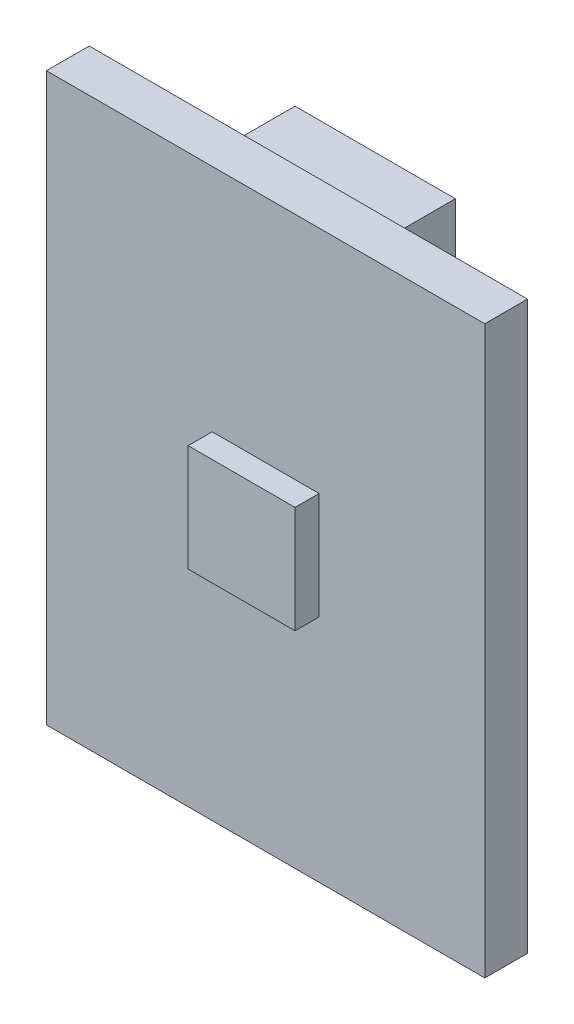
ISO-10303-21;
HEADER;
FILE_DESCRIPTION(('STEP AP214'),'2;1');
FILE_NAME('part.step','',(''),(''),'','','');
FILE_SCHEMA(('AUTOMOTIVE_DESIGN { 1 0 10303 214 1 1 1 1 }'));
ENDSEC;
DATA;
#1=APPLICATION_CONTEXT('core data for automotive mechanical design processes');
#2=APPLICATION_PROTOCOL_DEFINITION('international standard','automotive_design',2000,#1);
#3=PRODUCT_CONTEXT('',#1,'mechanical');
#4=PRODUCT('Part','Part','',(#3));
#5=PRODUCT_RELATED_PRODUCT_CATEGORY('part','',(#4));
#6=PRODUCT_DEFINITION_FORMATION('','',#4);
#7=PRODUCT_DEFINITION_CONTEXT('part definition',#1,'design');
#8=PRODUCT_DEFINITION('design','',#6,#7);
#9=PRODUCT_DEFINITION_SHAPE('','',#8);
#10=(LENGTH_UNIT() NAMED_UNIT(*) SI_UNIT(.MILLI.,.METRE.));
#11=(NAMED_UNIT(*) PLANE_ANGLE_UNIT() SI_UNIT($,.RADIAN.));
#12=(NAMED_UNIT(*) SI_UNIT($,.STERADIAN.) SOLID_ANGLE_UNIT());
#13=UNCERTAINTY_MEASURE_WITH_UNIT(LENGTH_MEASURE(1.E-05),#10,'distance_accuracy_value','');
#14=(GEOMETRIC_REPRESENTATION_CONTEXT(3) GLOBAL_UNCERTAINTY_ASSIGNED_CONTEXT((#13)) GLOBAL_UNIT_ASSIGNED_CONTEXT((#10,
#11,#12)) REPRESENTATION_CONTEXT('',''));
#15=CARTESIAN_POINT('',(0.,0.,0.));
#16=DIRECTION('',(0.,0.,1.));
#17=DIRECTION('',(1.,0.,0.));
#18=AXIS2_PLACEMENT_3D('',#15,#16,#17);
#19=CARTESIAN_POINT('',(0.,0.,14.7));
#20=DIRECTION('',(0.,0.,-1.));
#21=DIRECTION('',(-1.,0.,0.));
#22=AXIS2_PLACEMENT_3D('',#19,#20,#21);
#23=PLANE('',#22);
#24=DIRECTION('',(0.,1.,0.));
#25=VECTOR('',#24,1.);
#26=CARTESIAN_POINT('',(30.2,-7.6,14.7));
#27=LINE('',#26,#25);
#28=CARTESIAN_POINT('',(30.2,-7.6,14.7));
#29=VERTEX_POINT('',#28);
#30=CARTESIAN_POINT('',(30.2,13.6,14.7));
#31=VERTEX_POINT('',#30);
#32=EDGE_CURVE('E187',#29,#31,#27,.T.);
#33=ORIENTED_EDGE('',*,*,#32,.T.);
#34=DIRECTION('',(-1.,0.,0.));
#35=VECTOR('',#34,1.);
#36=CARTESIAN_POINT('',(13.8,13.6,14.7));
#37=LINE('',#36,#35);
#38=CARTESIAN_POINT('',(13.8,13.6,14.7));
#39=VERTEX_POINT('',#38);
#40=EDGE_CURVE('E190',#31,#39,#37,.T.);
#41=ORIENTED_EDGE('',*,*,#40,.T.);
#42=DIRECTION('',(0.,-1.,0.));
#43=VECTOR('',#42,1.);
#44=CARTESIAN_POINT('',(13.8,-7.6,14.7));
#45=LINE('',#44,#43);
#46=CARTESIAN_POINT('',(13.8,-7.6,14.7));
#47=VERTEX_POINT('',#46);
#48=EDGE_CURVE('E193',#39,#47,#45,.T.);
#49=ORIENTED_EDGE('',*,*,#48,.T.);
#50=DIRECTION('',(1.,0.,0.));
#51=VECTOR('',#50,1.);
#52=CARTESIAN_POINT('',(13.8,-7.6,14.7));
#53=LINE('',#52,#51);
#54=EDGE_CURVE('E195',#47,#29,#53,.T.);
#55=ORIENTED_EDGE('',*,*,#54,.T.);
#56=EDGE_LOOP('',(#33,#41,#49,#55));
#57=FACE_BOUND('',#56,.T.);
#58=DIRECTION('',(0.,1.,0.));
#59=VECTOR('',#58,1.);
#60=CARTESIAN_POINT('',(24.,1.,14.7));
#61=LINE('',#60,#59);
#62=CARTESIAN_POINT('',(24.,1.,14.7));
#63=VERTEX_POINT('',#62);
#64=CARTESIAN_POINT('',(24.,5.,14.7));
#65=VERTEX_POINT('',#64);
#66=EDGE_CURVE('E54',#63,#65,#61,.T.);
#67=ORIENTED_EDGE('',*,*,#66,.F.);
#68=DIRECTION('',(1.,0.,0.));
#69=VECTOR('',#68,1.);
#70=CARTESIAN_POINT('',(20.,1.,14.7));
#71=LINE('',#70,#69);
#72=CARTESIAN_POINT('',(20.,1.,14.7));
#73=VERTEX_POINT('',#72);
#74=EDGE_CURVE('E58',#73,#63,#71,.T.);
#75=ORIENTED_EDGE('',*,*,#74,.F.);
#76=DIRECTION('',(0.,-1.,0.));
#77=VECTOR('',#76,1.);
#78=CARTESIAN_POINT('',(20.,1.,14.7));
#79=LINE('',#78,#77);
#80=CARTESIAN_POINT('',(20.,5.,14.7));
#81=VERTEX_POINT('',#80);
#82=EDGE_CURVE('E445',#81,#73,#79,.T.);
#83=ORIENTED_EDGE('',*,*,#82,.F.);
#84=DIRECTION('',(-1.,0.,0.));
#85=VECTOR('',#84,1.);
#86=CARTESIAN_POINT('',(20.,5.,14.7));
#87=LINE('',#86,#85);
#88=EDGE_CURVE('E451',#65,#81,#87,.T.);
#89=ORIENTED_EDGE('',*,*,#88,.F.);
#90=EDGE_LOOP('',(#67,#75,#83,#89));
#91=FACE_BOUND('',#90,.T.);
#92=ADVANCED_FACE('F39',(#57,#91),#23,.F.);
#93=CARTESIAN_POINT('',(0.,0.,13.1));
#94=DIRECTION('',(0.,0.,-1.));
#95=DIRECTION('',(-1.,0.,0.));
#96=AXIS2_PLACEMENT_3D('',#93,#94,#95);
#97=PLANE('',#96);
#98=DIRECTION('',(0.,1.,0.));
#99=VECTOR('',#98,1.);
#100=CARTESIAN_POINT('',(30.2,-7.6,13.1));
#101=LINE('',#100,#99);
#102=CARTESIAN_POINT('',(30.2,-7.6,13.1));
#103=VERTEX_POINT('',#102);
#104=CARTESIAN_POINT('',(30.2,13.6,13.1));
#105=VERTEX_POINT('',#104);
#106=EDGE_CURVE('E186',#103,#105,#101,.T.);
#107=ORIENTED_EDGE('',*,*,#106,.F.);
#108=DIRECTION('',(1.,0.,0.));
#109=VECTOR('',#108,1.);
#110=CARTESIAN_POINT('',(13.8,-7.6,13.1));
#111=LINE('',#110,#109);
#112=CARTESIAN_POINT('',(13.8,-7.6,13.1));
#113=VERTEX_POINT('',#112);
#114=EDGE_CURVE('E191',#113,#103,#111,.T.);
#115=ORIENTED_EDGE('',*,*,#114,.F.);
#116=DIRECTION('',(0.,-1.,0.));
#117=VECTOR('',#116,1.);
#118=CARTESIAN_POINT('',(13.8,-7.6,13.1));
#119=LINE('',#118,#117);
#120=CARTESIAN_POINT('',(13.8,13.6,13.1));
#121=VERTEX_POINT('',#120);
#122=EDGE_CURVE('E202',#121,#113,#119,.T.);
#123=ORIENTED_EDGE('',*,*,#122,.F.);
#124=DIRECTION('',(-1.,0.,0.));
#125=VECTOR('',#124,1.);
#126=CARTESIAN_POINT('',(13.8,13.6,13.1));
#127=LINE('',#126,#125);
#128=EDGE_CURVE('E200',#105,#121,#127,.T.);
#129=ORIENTED_EDGE('',*,*,#128,.F.);
#130=EDGE_LOOP('',(#107,#115,#123,#129));
#131=FACE_BOUND('',#130,.T.);
#132=DIRECTION('',(1.,0.,0.));
#133=VECTOR('',#132,1.);
#134=CARTESIAN_POINT('',(19.,-7.,13.1));
#135=LINE('',#134,#133);
#136=CARTESIAN_POINT('',(19.,-7.,13.1));
#137=VERTEX_POINT('',#136);
#138=CARTESIAN_POINT('',(25.,-7.,13.1));
#139=VERTEX_POINT('',#138);
#140=EDGE_CURVE('E167',#137,#139,#135,.T.);
#141=ORIENTED_EDGE('',*,*,#140,.T.);
#142=DIRECTION('',(0.,1.,0.));
#143=VECTOR('',#142,1.);
#144=CARTESIAN_POINT('',(25.,-7.,13.1));
#145=LINE('',#144,#143);
#146=CARTESIAN_POINT('',(25.,13.,13.1));
#147=VERTEX_POINT('',#146);
#148=EDGE_CURVE('E157',#139,#147,#145,.T.);
#149=ORIENTED_EDGE('',*,*,#148,.T.);
#150=DIRECTION('',(-1.,0.,0.));
#151=VECTOR('',#150,1.);
#152=CARTESIAN_POINT('',(19.,13.,13.1));
#153=LINE('',#152,#151);
#154=CARTESIAN_POINT('',(19.,13.,13.1));
#155=VERTEX_POINT('',#154);
#156=EDGE_CURVE('E160',#147,#155,#153,.T.);
#157=ORIENTED_EDGE('',*,*,#156,.T.);
#158=DIRECTION('',(0.,-1.,0.));
#159=VECTOR('',#158,1.);
#160=CARTESIAN_POINT('',(19.,-7.,13.1));
#161=LINE('',#160,#159);
#162=EDGE_CURVE('E164',#155,#137,#161,.T.);
#163=ORIENTED_EDGE('',*,*,#162,.T.);
#164=EDGE_LOOP('',(#141,#149,#157,#163));
#165=FACE_BOUND('',#164,.T.);
#166=ADVANCED_FACE('F220',(#131,#165),#97,.T.);
#167=CARTESIAN_POINT('',(30.2,-7.6,14.7));
#168=DIRECTION('',(-1.,0.,0.));
#169=DIRECTION('',(0.,0.,1.));
#170=AXIS2_PLACEMENT_3D('',#167,#168,#169);
#171=PLANE('',#170);
#172=ORIENTED_EDGE('',*,*,#106,.T.);
#173=DIRECTION('',(0.,0.,-1.));
#174=VECTOR('',#173,1.);
#175=CARTESIAN_POINT('',(30.2,13.6,14.7));
#176=LINE('',#175,#174);
#177=EDGE_CURVE('E11',#31,#105,#176,.T.);
#178=ORIENTED_EDGE('',*,*,#177,.F.);
#179=ORIENTED_EDGE('',*,*,#32,.F.);
#180=DIRECTION('',(0.,0.,-1.));
#181=VECTOR('',#180,1.);
#182=CARTESIAN_POINT('',(30.2,-7.6,14.7));
#183=LINE('',#182,#181);
#184=EDGE_CURVE('E197',#29,#103,#183,.T.);
#185=ORIENTED_EDGE('',*,*,#184,.T.);
#186=EDGE_LOOP('',(#172,#178,#179,#185));
#187=FACE_BOUND('',#186,.T.);
#188=ADVANCED_FACE('F41',(#187),#171,.F.);
#189=CARTESIAN_POINT('',(13.8,13.6,14.7));
#190=DIRECTION('',(0.,-1.,0.));
#191=DIRECTION('',(0.,0.,-1.));
#192=AXIS2_PLACEMENT_3D('',#189,#190,#191);
#193=PLANE('',#192);
#194=ORIENTED_EDGE('',*,*,#128,.T.);
#195=DIRECTION('',(0.,0.,-1.));
#196=VECTOR('',#195,1.);
#197=CARTESIAN_POINT('',(13.8,13.6,14.7));
#198=LINE('',#197,#196);
#199=EDGE_CURVE('E47',#39,#121,#198,.T.);
#200=ORIENTED_EDGE('',*,*,#199,.F.);
#201=ORIENTED_EDGE('',*,*,#40,.F.);
#202=ORIENTED_EDGE('',*,*,#177,.T.);
#203=EDGE_LOOP('',(#194,#200,#201,#202));
#204=FACE_BOUND('',#203,.T.);
#205=ADVANCED_FACE('F230',(#204),#193,.F.);
#206=CARTESIAN_POINT('',(13.8,-7.6,14.7));
#207=DIRECTION('',(1.,0.,0.));
#208=DIRECTION('',(0.,0.,-1.));
#209=AXIS2_PLACEMENT_3D('',#206,#207,#208);
#210=PLANE('',#209);
#211=ORIENTED_EDGE('',*,*,#122,.T.);
#212=DIRECTION('',(0.,0.,-1.));
#213=VECTOR('',#212,1.);
#214=CARTESIAN_POINT('',(13.8,-7.6,14.7));
#215=LINE('',#214,#213);
#216=EDGE_CURVE('E207',#47,#113,#215,.T.);
#217=ORIENTED_EDGE('',*,*,#216,.F.);
#218=ORIENTED_EDGE('',*,*,#48,.F.);
#219=ORIENTED_EDGE('',*,*,#199,.T.);
#220=EDGE_LOOP('',(#211,#217,#218,#219));
#221=FACE_BOUND('',#220,.T.);
#222=ADVANCED_FACE('F214',(#221),#210,.F.);
#223=CARTESIAN_POINT('',(13.8,-7.6,14.7));
#224=DIRECTION('',(0.,1.,0.));
#225=DIRECTION('',(0.,0.,1.));
#226=AXIS2_PLACEMENT_3D('',#223,#224,#225);
#227=PLANE('',#226);
#228=ORIENTED_EDGE('',*,*,#114,.T.);
#229=ORIENTED_EDGE('',*,*,#184,.F.);
#230=ORIENTED_EDGE('',*,*,#54,.F.);
#231=ORIENTED_EDGE('',*,*,#216,.T.);
#232=EDGE_LOOP('',(#228,#229,#230,#231));
#233=FACE_BOUND('',#232,.T.);
#234=ADVANCED_FACE('F224',(#233),#227,.F.);
#235=CARTESIAN_POINT('',(25.,-7.,13.1));
#236=DIRECTION('',(-1.,0.,0.));
#237=DIRECTION('',(0.,0.,1.));
#238=AXIS2_PLACEMENT_3D('',#235,#236,#237);
#239=PLANE('',#238);
#240=DIRECTION('',(0.,1.,0.));
#241=VECTOR('',#240,1.);
#242=CARTESIAN_POINT('',(25.,-7.,10.6));
#243=LINE('',#242,#241);
#244=CARTESIAN_POINT('',(25.,-7.,10.6));
#245=VERTEX_POINT('',#244);
#246=CARTESIAN_POINT('',(25.,13.,10.6));
#247=VERTEX_POINT('',#246);
#248=EDGE_CURVE('E148',#245,#247,#243,.T.);
#249=ORIENTED_EDGE('',*,*,#248,.T.);
#250=DIRECTION('',(0.,0.,-1.));
#251=VECTOR('',#250,1.);
#252=CARTESIAN_POINT('',(25.,13.,13.1));
#253=LINE('',#252,#251);
#254=EDGE_CURVE('E183',#147,#247,#253,.T.);
#255=ORIENTED_EDGE('',*,*,#254,.F.);
#256=ORIENTED_EDGE('',*,*,#148,.F.);
#257=DIRECTION('',(0.,0.,-1.));
#258=VECTOR('',#257,1.);
#259=CARTESIAN_POINT('',(25.,-7.,13.1));
#260=LINE('',#259,#258);
#261=EDGE_CURVE('E169',#139,#245,#260,.T.);
#262=ORIENTED_EDGE('',*,*,#261,.T.);
#263=EDGE_LOOP('',(#249,#255,#256,#262));
#264=FACE_BOUND('',#263,.T.);
#265=ADVANCED_FACE('F244',(#264),#239,.F.);
#266=CARTESIAN_POINT('',(19.,13.,13.1));
#267=DIRECTION('',(0.,-1.,0.));
#268=DIRECTION('',(0.,0.,-1.));
#269=AXIS2_PLACEMENT_3D('',#266,#267,#268);
#270=PLANE('',#269);
#271=DIRECTION('',(-1.,0.,0.));
#272=VECTOR('',#271,1.);
#273=CARTESIAN_POINT('',(19.,13.,10.6));
#274=LINE('',#273,#272);
#275=CARTESIAN_POINT('',(19.,13.,10.6));
#276=VERTEX_POINT('',#275);
#277=EDGE_CURVE('E151',#247,#276,#274,.T.);
#278=ORIENTED_EDGE('',*,*,#277,.T.);
#279=DIRECTION('',(0.,0.,-1.));
#280=VECTOR('',#279,1.);
#281=CARTESIAN_POINT('',(19.,13.,13.1));
#282=LINE('',#281,#280);
#283=EDGE_CURVE('E180',#155,#276,#282,.T.);
#284=ORIENTED_EDGE('',*,*,#283,.F.);
#285=ORIENTED_EDGE('',*,*,#156,.F.);
#286=ORIENTED_EDGE('',*,*,#254,.T.);
#287=EDGE_LOOP('',(#278,#284,#285,#286));
#288=FACE_BOUND('',#287,.T.);
#289=ADVANCED_FACE('F251',(#288),#270,.F.);
#290=CARTESIAN_POINT('',(19.,-7.,13.1));
#291=DIRECTION('',(1.,0.,0.));
#292=DIRECTION('',(0.,0.,-1.));
#293=AXIS2_PLACEMENT_3D('',#290,#291,#292);
#294=PLANE('',#293);
#295=DIRECTION('',(0.,-1.,0.));
#296=VECTOR('',#295,1.);
#297=CARTESIAN_POINT('',(19.,-7.,10.6));
#298=LINE('',#297,#296);
#299=CARTESIAN_POINT('',(19.,-7.,10.6));
#300=VERTEX_POINT('',#299);
#301=EDGE_CURVE('E172',#276,#300,#298,.T.);
#302=ORIENTED_EDGE('',*,*,#301,.T.);
#303=DIRECTION('',(0.,0.,-1.));
#304=VECTOR('',#303,1.);
#305=CARTESIAN_POINT('',(19.,-7.,13.1));
#306=LINE('',#305,#304);
#307=EDGE_CURVE('E177',#137,#300,#306,.T.);
#308=ORIENTED_EDGE('',*,*,#307,.F.);
#309=ORIENTED_EDGE('',*,*,#162,.F.);
#310=ORIENTED_EDGE('',*,*,#283,.T.);
#311=EDGE_LOOP('',(#302,#308,#309,#310));
#312=FACE_BOUND('',#311,.T.);
#313=ADVANCED_FACE('F256',(#312),#294,.F.);
#314=CARTESIAN_POINT('',(19.,-7.,13.1));
#315=DIRECTION('',(0.,1.,0.));
#316=DIRECTION('',(0.,0.,1.));
#317=AXIS2_PLACEMENT_3D('',#314,#315,#316);
#318=PLANE('',#317);
#319=DIRECTION('',(1.,0.,0.));
#320=VECTOR('',#319,1.);
#321=CARTESIAN_POINT('',(19.,-7.,10.6));
#322=LINE('',#321,#320);
#323=EDGE_CURVE('E161',#300,#245,#322,.T.);
#324=ORIENTED_EDGE('',*,*,#323,.T.);
#325=ORIENTED_EDGE('',*,*,#261,.F.);
#326=ORIENTED_EDGE('',*,*,#140,.F.);
#327=ORIENTED_EDGE('',*,*,#307,.T.);
#328=EDGE_LOOP('',(#324,#325,#326,#327));
#329=FACE_BOUND('',#328,.T.);
#330=ADVANCED_FACE('F268',(#329),#318,.F.);
#331=CARTESIAN_POINT('',(0.,0.,10.6));
#332=DIRECTION('',(0.,0.,-1.));
#333=DIRECTION('',(-1.,0.,0.));
#334=AXIS2_PLACEMENT_3D('',#331,#332,#333);
#335=PLANE('',#334);
#336=ORIENTED_EDGE('',*,*,#248,.F.);
#337=ORIENTED_EDGE('',*,*,#323,.F.);
#338=ORIENTED_EDGE('',*,*,#301,.F.);
#339=ORIENTED_EDGE('',*,*,#277,.F.);
#340=EDGE_LOOP('',(#336,#337,#338,#339));
#341=FACE_BOUND('',#340,.T.);
#342=ADVANCED_FACE('F263',(#341),#335,.T.);
#343=CARTESIAN_POINT('',(24.,1.,15.6));
#344=DIRECTION('',(-1.,0.,0.));
#345=DIRECTION('',(0.,0.,1.));
#346=AXIS2_PLACEMENT_3D('',#343,#344,#345);
#347=PLANE('',#346);
#348=ORIENTED_EDGE('',*,*,#66,.T.);
#349=DIRECTION('',(0.,0.,-1.));
#350=VECTOR('',#349,1.);
#351=CARTESIAN_POINT('',(24.,5.,15.6));
#352=LINE('',#351,#350);
#353=CARTESIAN_POINT('',(24.,5.,15.6));
#354=VERTEX_POINT('',#353);
#355=EDGE_CURVE('E131',#354,#65,#352,.T.);
#356=ORIENTED_EDGE('',*,*,#355,.F.);
#357=DIRECTION('',(0.,1.,0.));
#358=VECTOR('',#357,1.);
#359=CARTESIAN_POINT('',(24.,1.,15.6));
#360=LINE('',#359,#358);
#361=CARTESIAN_POINT('',(24.,1.,15.6));
#362=VERTEX_POINT('',#361);
#363=EDGE_CURVE('E137',#362,#354,#360,.T.);
#364=ORIENTED_EDGE('',*,*,#363,.F.);
#365=DIRECTION('',(0.,0.,-1.));
#366=VECTOR('',#365,1.);
#367=CARTESIAN_POINT('',(24.,1.,15.6));
#368=LINE('',#367,#366);
#369=EDGE_CURVE('E443',#362,#63,#368,.T.);
#370=ORIENTED_EDGE('',*,*,#369,.T.);
#371=EDGE_LOOP('',(#348,#356,#364,#370));
#372=FACE_BOUND('',#371,.T.);
#373=ADVANCED_FACE('F147',(#372),#347,.F.);
#374=CARTESIAN_POINT('',(20.,5.,15.6));
#375=DIRECTION('',(0.,-1.,0.));
#376=DIRECTION('',(0.,0.,-1.));
#377=AXIS2_PLACEMENT_3D('',#374,#375,#376);
#378=PLANE('',#377);
#379=ORIENTED_EDGE('',*,*,#88,.T.);
#380=DIRECTION('',(0.,0.,-1.));
#381=VECTOR('',#380,1.);
#382=CARTESIAN_POINT('',(20.,5.,15.6));
#383=LINE('',#382,#381);
#384=CARTESIAN_POINT('',(20.,5.,15.6));
#385=VERTEX_POINT('',#384);
#386=EDGE_CURVE('E133',#385,#81,#383,.T.);
#387=ORIENTED_EDGE('',*,*,#386,.F.);
#388=DIRECTION('',(-1.,0.,0.));
#389=VECTOR('',#388,1.);
#390=CARTESIAN_POINT('',(20.,5.,15.6));
#391=LINE('',#390,#389);
#392=EDGE_CURVE('E126',#354,#385,#391,.T.);
#393=ORIENTED_EDGE('',*,*,#392,.F.);
#394=ORIENTED_EDGE('',*,*,#355,.T.);
#395=EDGE_LOOP('',(#379,#387,#393,#394));
#396=FACE_BOUND('',#395,.T.);
#397=ADVANCED_FACE('F129',(#396),#378,.F.);
#398=CARTESIAN_POINT('',(20.,1.,15.6));
#399=DIRECTION('',(1.,0.,0.));
#400=DIRECTION('',(0.,0.,-1.));
#401=AXIS2_PLACEMENT_3D('',#398,#399,#400);
#402=PLANE('',#401);
#403=ORIENTED_EDGE('',*,*,#82,.T.);
#404=DIRECTION('',(0.,0.,-1.));
#405=VECTOR('',#404,1.);
#406=CARTESIAN_POINT('',(20.,1.,15.6));
#407=LINE('',#406,#405);
#408=CARTESIAN_POINT('',(20.,1.,15.6));
#409=VERTEX_POINT('',#408);
#410=EDGE_CURVE('E153',#409,#73,#407,.T.);
#411=ORIENTED_EDGE('',*,*,#410,.F.);
#412=DIRECTION('',(0.,-1.,0.));
#413=VECTOR('',#412,1.);
#414=CARTESIAN_POINT('',(20.,1.,15.6));
#415=LINE('',#414,#413);
#416=EDGE_CURVE('E136',#385,#409,#415,.T.);
#417=ORIENTED_EDGE('',*,*,#416,.F.);
#418=ORIENTED_EDGE('',*,*,#386,.T.);
#419=EDGE_LOOP('',(#403,#411,#417,#418));
#420=FACE_BOUND('',#419,.T.);
#421=ADVANCED_FACE('F283',(#420),#402,.F.);
#422=CARTESIAN_POINT('',(20.,1.,15.6));
#423=DIRECTION('',(0.,1.,0.));
#424=DIRECTION('',(0.,0.,1.));
#425=AXIS2_PLACEMENT_3D('',#422,#423,#424);
#426=PLANE('',#425);
#427=ORIENTED_EDGE('',*,*,#74,.T.);
#428=ORIENTED_EDGE('',*,*,#369,.F.);
#429=DIRECTION('',(1.,0.,0.));
#430=VECTOR('',#429,1.);
#431=CARTESIAN_POINT('',(20.,1.,15.6));
#432=LINE('',#431,#430);
#433=EDGE_CURVE('E142',#409,#362,#432,.T.);
#434=ORIENTED_EDGE('',*,*,#433,.F.);
#435=ORIENTED_EDGE('',*,*,#410,.T.);
#436=EDGE_LOOP('',(#427,#428,#434,#435));
#437=FACE_BOUND('',#436,.T.);
#438=ADVANCED_FACE('F286',(#437),#426,.F.);
#439=CARTESIAN_POINT('',(0.,0.,15.6));
#440=DIRECTION('',(0.,0.,-1.));
#441=DIRECTION('',(-1.,0.,0.));
#442=AXIS2_PLACEMENT_3D('',#439,#440,#441);
#443=PLANE('',#442);
#444=ORIENTED_EDGE('',*,*,#363,.T.);
#445=ORIENTED_EDGE('',*,*,#392,.T.);
#446=ORIENTED_EDGE('',*,*,#416,.T.);
#447=ORIENTED_EDGE('',*,*,#433,.T.);
#448=EDGE_LOOP('',(#444,#445,#446,#447));
#449=FACE_BOUND('',#448,.T.);
#450=ADVANCED_FACE('F140',(#449),#443,.F.);
#451=CLOSED_SHELL('',(#92,#166,#188,#205,#222,#234,#265,#289,#313,#330,#342,#373,#397,#421,#438,#450));
#452=MANIFOLD_SOLID_BREP('B2',#451);
#453=ADVANCED_BREP_SHAPE_REPRESENTATION('',(#18,#452),#14);
#454=SHAPE_DEFINITION_REPRESENTATION(#9,#453);
ENDSEC;
END-ISO-10303-21;
